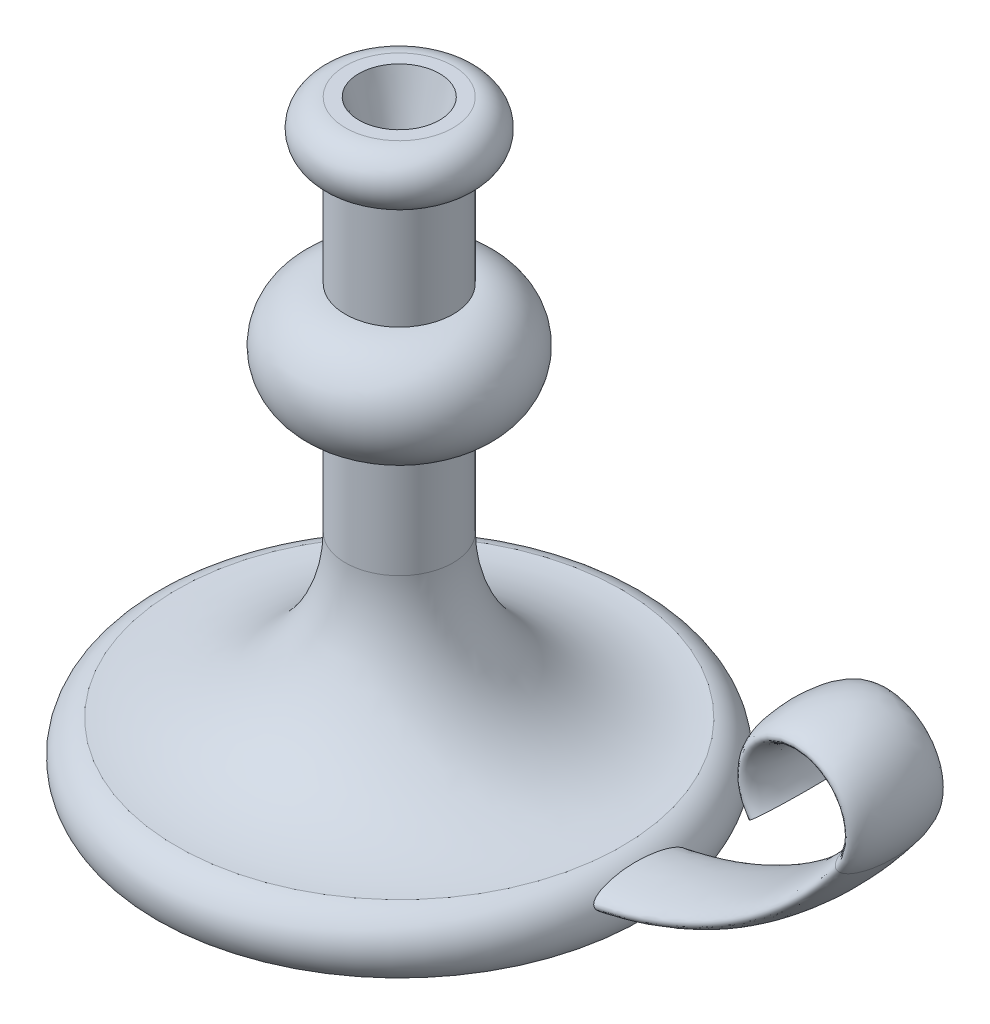
ISO-10303-21;
HEADER;
FILE_DESCRIPTION(('STEP AP214'),'2;1');
FILE_NAME('part.step','',(''),(''),'','','');
FILE_SCHEMA(('AUTOMOTIVE_DESIGN { 1 0 10303 214 1 1 1 1 }'));
ENDSEC;
DATA;
#1=APPLICATION_CONTEXT('core data for automotive mechanical design processes');
#2=APPLICATION_PROTOCOL_DEFINITION('international standard','automotive_design',2000,#1);
#3=PRODUCT_CONTEXT('',#1,'mechanical');
#4=PRODUCT('Part','Part','',(#3));
#5=PRODUCT_RELATED_PRODUCT_CATEGORY('part','',(#4));
#6=PRODUCT_DEFINITION_FORMATION('','',#4);
#7=PRODUCT_DEFINITION_CONTEXT('part definition',#1,'design');
#8=PRODUCT_DEFINITION('design','',#6,#7);
#9=PRODUCT_DEFINITION_SHAPE('','',#8);
#10=(LENGTH_UNIT() NAMED_UNIT(*) SI_UNIT(.MILLI.,.METRE.));
#11=(NAMED_UNIT(*) PLANE_ANGLE_UNIT() SI_UNIT($,.RADIAN.));
#12=(NAMED_UNIT(*) SI_UNIT($,.STERADIAN.) SOLID_ANGLE_UNIT());
#13=UNCERTAINTY_MEASURE_WITH_UNIT(LENGTH_MEASURE(1.E-05),#10,'distance_accuracy_value','');
#14=(GEOMETRIC_REPRESENTATION_CONTEXT(3) GLOBAL_UNCERTAINTY_ASSIGNED_CONTEXT((#13)) GLOBAL_UNIT_ASSIGNED_CONTEXT((#10,
#11,#12)) REPRESENTATION_CONTEXT('',''));
#15=CARTESIAN_POINT('',(0.,0.,0.));
#16=DIRECTION('',(0.,0.,1.));
#17=DIRECTION('',(1.,0.,0.));
#18=AXIS2_PLACEMENT_3D('',#15,#16,#17);
#19=CARTESIAN_POINT('',(90.,0.,0.));
#20=DIRECTION('',(0.,-1.,0.));
#21=DIRECTION('',(0.,0.,-1.));
#22=AXIS2_PLACEMENT_3D('',#19,#20,#21);
#23=PLANE('',#22);
#24=CARTESIAN_POINT('',(0.,0.,0.));
#25=DIRECTION('',(0.,-1.,0.));
#26=DIRECTION('',(0.,0.,-1.));
#27=AXIS2_PLACEMENT_3D('',#24,#25,#26);
#28=CIRCLE('',#27,90.);
#29=CARTESIAN_POINT('',(0.,0.,-90.));
#30=VERTEX_POINT('',#29);
#31=EDGE_CURVE('E77',#30,#30,#28,.T.);
#32=ORIENTED_EDGE('',*,*,#31,.T.);
#33=EDGE_LOOP('',(#32));
#34=FACE_BOUND('',#33,.T.);
#35=ADVANCED_FACE('F37',(#34),#23,.T.);
#36=CARTESIAN_POINT('',(0.,220.,0.));
#37=DIRECTION('',(0.,1.,0.));
#38=DIRECTION('',(0.,0.,1.));
#39=AXIS2_PLACEMENT_3D('',#36,#37,#38);
#40=PLANE('',#39);
#41=CARTESIAN_POINT('',(0.,220.,0.));
#42=DIRECTION('',(0.,1.,0.));
#43=DIRECTION('',(0.,0.,1.));
#44=AXIS2_PLACEMENT_3D('',#41,#42,#43);
#45=CIRCLE('',#44,15.);
#46=CARTESIAN_POINT('',(0.,220.,15.));
#47=VERTEX_POINT('',#46);
#48=EDGE_CURVE('E93',#47,#47,#45,.T.);
#49=ORIENTED_EDGE('',*,*,#48,.F.);
#50=EDGE_LOOP('',(#49));
#51=FACE_BOUND('',#50,.T.);
#52=CARTESIAN_POINT('',(0.,220.,0.));
#53=DIRECTION('',(0.,-1.,0.));
#54=DIRECTION('',(0.,0.,-1.));
#55=AXIS2_PLACEMENT_3D('',#52,#53,#54);
#56=CIRCLE('',#55,20.);
#57=CARTESIAN_POINT('',(0.,220.,-20.));
#58=VERTEX_POINT('',#57);
#59=EDGE_CURVE('E49',#58,#58,#56,.T.);
#60=ORIENTED_EDGE('',*,*,#59,.F.);
#61=EDGE_LOOP('',(#60));
#62=FACE_BOUND('',#61,.T.);
#63=ADVANCED_FACE('F100',(#51,#62),#40,.T.);
#64=CARTESIAN_POINT('',(0.,210.,0.));
#65=DIRECTION('',(0.,-1.,0.));
#66=DIRECTION('',(0.,0.,-1.));
#67=AXIS2_PLACEMENT_3D('',#64,#65,#66);
#68=TOROIDAL_SURFACE('',#67,20.,10.);
#69=ORIENTED_EDGE('',*,*,#59,.T.);
#70=EDGE_LOOP('',(#69));
#71=FACE_BOUND('',#70,.T.);
#72=CARTESIAN_POINT('',(0.,200.,0.));
#73=DIRECTION('',(0.,-1.,0.));
#74=DIRECTION('',(0.,0.,-1.));
#75=AXIS2_PLACEMENT_3D('',#72,#73,#74);
#76=CIRCLE('',#75,20.);
#77=CARTESIAN_POINT('',(0.,200.,-20.));
#78=VERTEX_POINT('',#77);
#79=EDGE_CURVE('E54',#78,#78,#76,.T.);
#80=ORIENTED_EDGE('',*,*,#79,.F.);
#81=EDGE_LOOP('',(#80));
#82=FACE_BOUND('',#81,.T.);
#83=ADVANCED_FACE('F103',(#71,#82),#68,.T.);
#84=CARTESIAN_POINT('',(0.,0.,0.));
#85=DIRECTION('',(0.,-1.,0.));
#86=DIRECTION('',(0.,0.,-1.));
#87=AXIS2_PLACEMENT_3D('',#84,#85,#86);
#88=CYLINDRICAL_SURFACE('',#87,20.);
#89=ORIENTED_EDGE('',*,*,#79,.T.);
#90=EDGE_LOOP('',(#89));
#91=FACE_BOUND('',#90,.T.);
#92=CARTESIAN_POINT('',(0.,160.,0.));
#93=DIRECTION('',(0.,-1.,0.));
#94=DIRECTION('',(0.,0.,-1.));
#95=AXIS2_PLACEMENT_3D('',#92,#93,#94);
#96=CIRCLE('',#95,20.);
#97=CARTESIAN_POINT('',(0.,160.,-20.));
#98=VERTEX_POINT('',#97);
#99=EDGE_CURVE('E59',#98,#98,#96,.T.);
#100=ORIENTED_EDGE('',*,*,#99,.F.);
#101=EDGE_LOOP('',(#100));
#102=FACE_BOUND('',#101,.T.);
#103=ADVANCED_FACE('F109',(#91,#102),#88,.T.);
#104=CARTESIAN_POINT('',(0.,140.,0.));
#105=DIRECTION('',(0.,-1.,0.));
#106=DIRECTION('',(0.,0.,-1.));
#107=AXIS2_PLACEMENT_3D('',#104,#105,#106);
#108=TOROIDAL_SURFACE('',#107,20.,20.);
#109=ORIENTED_EDGE('',*,*,#99,.T.);
#110=EDGE_LOOP('',(#109));
#111=FACE_BOUND('',#110,.T.);
#112=CARTESIAN_POINT('',(0.,120.,0.));
#113=DIRECTION('',(0.,-1.,0.));
#114=DIRECTION('',(0.,0.,-1.));
#115=AXIS2_PLACEMENT_3D('',#112,#113,#114);
#116=CIRCLE('',#115,20.);
#117=CARTESIAN_POINT('',(0.,120.,-20.));
#118=VERTEX_POINT('',#117);
#119=EDGE_CURVE('E65',#118,#118,#116,.T.);
#120=ORIENTED_EDGE('',*,*,#119,.F.);
#121=EDGE_LOOP('',(#120));
#122=FACE_BOUND('',#121,.T.);
#123=ADVANCED_FACE('F116',(#111,#122),#108,.T.);
#124=CARTESIAN_POINT('',(0.,0.,0.));
#125=DIRECTION('',(0.,-1.,0.));
#126=DIRECTION('',(0.,0.,-1.));
#127=AXIS2_PLACEMENT_3D('',#124,#125,#126);
#128=CYLINDRICAL_SURFACE('',#127,20.);
#129=ORIENTED_EDGE('',*,*,#119,.T.);
#130=EDGE_LOOP('',(#129));
#131=FACE_BOUND('',#130,.T.);
#132=CARTESIAN_POINT('',(0.,80.,0.));
#133=DIRECTION('',(0.,-1.,0.));
#134=DIRECTION('',(0.,0.,-1.));
#135=AXIS2_PLACEMENT_3D('',#132,#133,#134);
#136=CIRCLE('',#135,20.);
#137=CARTESIAN_POINT('',(0.,80.,-20.));
#138=VERTEX_POINT('',#137);
#139=EDGE_CURVE('E69',#138,#138,#136,.T.);
#140=ORIENTED_EDGE('',*,*,#139,.F.);
#141=EDGE_LOOP('',(#140));
#142=FACE_BOUND('',#141,.T.);
#143=ADVANCED_FACE('F120',(#131,#142),#128,.T.);
#144=CARTESIAN_POINT('',(0.,80.,0.));
#145=DIRECTION('',(0.,-1.,0.));
#146=DIRECTION('',(0.,0.,-1.));
#147=AXIS2_PLACEMENT_3D('',#144,#145,#146);
#148=TOROIDAL_SURFACE('',#147,80.,60.);
#149=ORIENTED_EDGE('',*,*,#139,.T.);
#150=EDGE_LOOP('',(#149));
#151=FACE_BOUND('',#150,.T.);
#152=CARTESIAN_POINT('',(0.,20.0604127662106,0.));
#153=DIRECTION('',(0.,-1.,0.));
#154=DIRECTION('',(0.,0.,-1.));
#155=AXIS2_PLACEMENT_3D('',#152,#153,#154);
#156=CIRCLE('',#155,82.6918176466758);
#157=CARTESIAN_POINT('',(0.,20.0604127662106,-82.6918176466758));
#158=VERTEX_POINT('',#157);
#159=EDGE_CURVE('E73',#158,#158,#156,.T.);
#160=ORIENTED_EDGE('',*,*,#159,.F.);
#161=EDGE_LOOP('',(#160));
#162=FACE_BOUND('',#161,.T.);
#163=ADVANCED_FACE('F124',(#151,#162),#148,.F.);
#164=CARTESIAN_POINT('',(0.,7.80412955860876,0.));
#165=DIRECTION('',(0.,-1.,0.));
#166=DIRECTION('',(0.,0.,-1.));
#167=AXIS2_PLACEMENT_3D('',#164,#165,#166);
#168=TOROIDAL_SURFACE('',#167,80.2354947983808,12.5);
#169=CARTESIAN_POINT('',(89.9114544430694,13.0125689281557,-17.5));
#170=CARTESIAN_POINT('',(89.8918494395581,13.0545530568692,-17.5000000319673));
#171=CARTESIAN_POINT('',(89.8723504327383,13.0965846784311,-17.4978616994481));
#172=CARTESIAN_POINT('',(89.8337139252528,13.1803940796436,-17.4893712876347));
#173=CARTESIAN_POINT('',(89.8145765496319,13.2221717682207,-17.483017777278));
#174=CARTESIAN_POINT('',(89.7578731512287,13.346708318175,-17.4578478667639));
#175=CARTESIAN_POINT('',(89.7210409983536,13.4286167287498,-17.4329224062271));
#176=CARTESIAN_POINT('',(89.6406792049487,13.6092209648176,-17.3608448932182));
#177=CARTESIAN_POINT('',(89.5979751658117,13.7065845766453,-17.3095434723645));
#178=CARTESIAN_POINT('',(89.5171026408207,13.8929585907188,-17.1907966743208));
#179=CARTESIAN_POINT('',(89.4789438379574,13.9819510775946,-17.1233177224062));
#180=CARTESIAN_POINT('',(89.4116736112444,14.1401772187551,-16.987033069735));
#181=CARTESIAN_POINT('',(89.3820378112262,14.2104511287674,-16.9196600451393));
#182=CARTESIAN_POINT('',(89.325399064382,14.3455590100735,-16.7785892478866));
#183=CARTESIAN_POINT('',(89.2983982616031,14.4103885454998,-16.7048864149547));
#184=CARTESIAN_POINT('',(89.2466021341337,14.5353360181844,-16.5525791880883));
#185=CARTESIAN_POINT('',(89.221812380942,14.5954420099687,-16.473963216068));
#186=CARTESIAN_POINT('',(89.1741784944434,14.7113500324322,-16.3131205829986));
#187=CARTESIAN_POINT('',(89.1513337388886,14.7671534390602,-16.2308950895712));
#188=CARTESIAN_POINT('',(89.107709728951,14.8739907970425,-16.0651636374164));
#189=CARTESIAN_POINT('',(89.0868998486337,14.9250944003824,-15.981710339594));
#190=CARTESIAN_POINT('',(89.0466530681218,15.0240996238771,-15.8125951745059));
#191=CARTESIAN_POINT('',(89.0272163988087,15.0720007055112,-15.7269329391352));
#192=CARTESIAN_POINT('',(88.970633129127,15.2115786807179,-15.4670076578166));
#193=CARTESIAN_POINT('',(88.9352760512811,15.2989759599603,-15.2900515329948));
#194=CARTESIAN_POINT('',(88.8682321852758,15.4645932241146,-14.931113227645));
#195=CARTESIAN_POINT('',(88.8365485336999,15.5428053669521,-14.7491269138523));
#196=CARTESIAN_POINT('',(88.7760111160484,15.6918660893829,-14.3807677093742));
#197=CARTESIAN_POINT('',(88.7471704021251,15.7626807881072,-14.1943790524225));
#198=CARTESIAN_POINT('',(88.6919757173861,15.8976496826662,-13.8190963338719));
#199=CARTESIAN_POINT('',(88.66561905978,15.9618110825145,-13.6302052372373));
#200=CARTESIAN_POINT('',(88.6149798687737,16.0844299690812,-13.2503701378379));
#201=CARTESIAN_POINT('',(88.5906968145087,16.1428888887237,-13.059426664254));
#202=CARTESIAN_POINT('',(88.5377615196411,16.2695248465864,-12.625450487648));
#203=CARTESIAN_POINT('',(88.5096389351837,16.3362164133888,-12.3819206103052));
#204=CARTESIAN_POINT('',(88.4558187755346,16.4627040817498,-11.8927984945203));
#205=CARTESIAN_POINT('',(88.4301214509904,16.5224994707386,-11.6472060457641));
#206=CARTESIAN_POINT('',(88.3808547036374,16.6360257318877,-11.1542883330223));
#207=CARTESIAN_POINT('',(88.3572863345827,16.6897536041079,-10.9069622755211));
#208=CARTESIAN_POINT('',(88.3120890956765,16.7917430703065,-10.4110050573224));
#209=CARTESIAN_POINT('',(88.2904603193291,16.8400044007827,-10.1623738343163));
#210=CARTESIAN_POINT('',(88.228358088122,16.9771494214216,-9.41609815932357));
#211=CARTESIAN_POINT('',(88.1905502060862,17.0586655679709,-8.91686712846689));
#212=CARTESIAN_POINT('',(88.1214020732877,17.2049527206175,-7.91567344613707));
#213=CARTESIAN_POINT('',(88.0900604561217,17.2697272651589,-7.4137113948203));
#214=CARTESIAN_POINT('',(88.0332656397219,17.3851531615458,-6.40224820872872));
#215=CARTESIAN_POINT('',(88.0078808136195,17.4356417739203,-5.8927247796836));
#216=CARTESIAN_POINT('',(87.9633782691026,17.5229541868558,-4.87216057853119));
#217=CARTESIAN_POINT('',(87.9442616188409,17.5597756585557,-4.36111956277019));
#218=CARTESIAN_POINT('',(87.9123350647478,17.6206852097668,-3.33803811783719));
#219=CARTESIAN_POINT('',(87.8995257780697,17.6447720432556,-2.82599759578626));
#220=CARTESIAN_POINT('',(87.8802886743684,17.6807673404776,-1.80201046558594));
#221=CARTESIAN_POINT('',(87.8738529339738,17.6926909256946,-1.29006453387251));
#222=CARTESIAN_POINT('',(87.8673761341253,17.7046899029697,-0.266051492955921));
#223=CARTESIAN_POINT('',(87.8673343738584,17.7047665935081,0.246015596815396));
#224=CARTESIAN_POINT('',(87.8736438178989,17.6930790003066,1.26991908599158));
#225=CARTESIAN_POINT('',(87.8799942625184,17.6813161236518,1.78175550557891));
#226=CARTESIAN_POINT('',(87.89668867555,17.6500821071934,2.67827228013831));
#227=CARTESIAN_POINT('',(87.9056553319473,17.6332391424615,3.06307216481819));
#228=CARTESIAN_POINT('',(87.9271602547281,17.5924564185168,3.83221579572617));
#229=CARTESIAN_POINT('',(87.9396986724284,17.5685163586352,4.21655952193633));
#230=CARTESIAN_POINT('',(87.9683287679903,17.5131974606373,4.9846639370352));
#231=CARTESIAN_POINT('',(87.9844212097317,17.4818170232256,5.36842448269732));
#232=CARTESIAN_POINT('',(88.0202626524263,17.4109398475768,6.1373802979259));
#233=CARTESIAN_POINT('',(88.0400332303278,17.3713950564618,6.52257016032518));
#234=CARTESIAN_POINT('',(88.0831976593449,17.2836788187787,7.29169206402316));
#235=CARTESIAN_POINT('',(88.1065908103914,17.2355090387257,7.67562433374591));
#236=CARTESIAN_POINT('',(88.1570902415786,17.1297276732935,8.44169087826621));
#237=CARTESIAN_POINT('',(88.1841940243445,17.0721224332046,8.82382618505682));
#238=CARTESIAN_POINT('',(88.2353336953938,16.9614800973801,9.49413561550508));
#239=CARTESIAN_POINT('',(88.2585331091088,16.9106916135408,9.7827449362751));
#240=CARTESIAN_POINT('',(88.3073711486581,16.8023449409606,10.358542068486));
#241=CARTESIAN_POINT('',(88.3330101863262,16.7447856088419,10.6457296312806));
#242=CARTESIAN_POINT('',(88.3870022917324,16.6219962369627,11.2185881452186));
#243=CARTESIAN_POINT('',(88.415358682873,16.5567567813337,11.5042567763468));
#244=CARTESIAN_POINT('',(88.4752065184668,16.4173842366178,12.073911282692));
#245=CARTESIAN_POINT('',(88.5067060351209,16.3432281422386,12.3578907316051));
#246=CARTESIAN_POINT('',(88.5730837541478,16.1852713271672,12.9204192746571));
#247=CARTESIAN_POINT('',(88.6079344939969,16.101548091434,13.198993226738));
#248=CARTESIAN_POINT('',(88.6820169701415,15.9220388966035,13.7515317514426));
#249=CARTESIAN_POINT('',(88.7212461207402,15.826260052793,14.0254989357631));
#250=CARTESIAN_POINT('',(88.784298447332,15.6714655912648,14.4310368085304));
#251=CARTESIAN_POINT('',(88.8059796131556,15.6181064840729,14.5651055420863));
#252=CARTESIAN_POINT('',(88.8509969663771,15.5071330133266,14.8311813676797));
#253=CARTESIAN_POINT('',(88.874332952792,15.4495191664882,14.9631887077114));
#254=CARTESIAN_POINT('',(88.9228920197364,15.3295709094703,15.2242658639003));
#255=CARTESIAN_POINT('',(88.9481099494214,15.2672493788046,15.3533425220726));
#256=CARTESIAN_POINT('',(89.0008658041441,15.1369822061495,15.6081195367423));
#257=CARTESIAN_POINT('',(89.02840305892,15.069038189101,15.7338208549244));
#258=CARTESIAN_POINT('',(89.0836770066014,14.9329939489932,15.9695103317954));
#259=CARTESIAN_POINT('',(89.1111673078318,14.8654710820042,16.0798871709336));
#260=CARTESIAN_POINT('',(89.1690263796384,14.7238990232618,16.295792455218));
#261=CARTESIAN_POINT('',(89.1993976947806,14.649844066369,16.4013164898349));
#262=CARTESIAN_POINT('',(89.2633854302169,14.4947164266399,16.6046513902326));
#263=CARTESIAN_POINT('',(89.2969733014981,14.413706042058,16.7025182437987));
#264=CARTESIAN_POINT('',(89.3683678578543,14.2428755728112,16.888483678993));
#265=CARTESIAN_POINT('',(89.4061665989549,14.1530721141386,16.9766000494129));
#266=CARTESIAN_POINT('',(89.4620835027711,14.0216344491933,17.0888331515603));
#267=CARTESIAN_POINT('',(89.4780446145758,13.9842588476568,17.119041100064));
#268=CARTESIAN_POINT('',(89.5107674575487,13.9079725126696,17.1769624205162));
#269=CARTESIAN_POINT('',(89.527529130448,13.8690618909811,17.2046759735971));
#270=CARTESIAN_POINT('',(89.5791144202158,13.7498948812134,17.2835357561082));
#271=CARTESIAN_POINT('',(89.6152350880301,13.6672109451011,17.3303944456741));
#272=CARTESIAN_POINT('',(89.6721204064053,13.5385195149415,17.3894500941522));
#273=CARTESIAN_POINT('',(89.6916708173401,13.4945393221642,17.407343100003));
#274=CARTESIAN_POINT('',(89.7315515303102,13.40538753744,17.4387255057197));
#275=CARTESIAN_POINT('',(89.7518813719119,13.3602166536528,17.4522174619584));
#276=CARTESIAN_POINT('',(89.7931810654115,13.2690638240633,17.4743638038556));
#277=CARTESIAN_POINT('',(89.8141499824111,13.2230831009881,17.4830249290395));
#278=CARTESIAN_POINT('',(89.8565869704469,13.1306750009577,17.4952415864618));
#279=CARTESIAN_POINT('',(89.8780549771552,13.0842476820121,17.4987977730138));
#280=CARTESIAN_POINT('',(89.9189551395976,12.9964313315604,17.5005858375242));
#281=CARTESIAN_POINT('',(89.9383573451177,12.955038579531,17.4993502422538));
#282=CARTESIAN_POINT('',(89.9772458427185,12.8726129569078,17.4927830362649));
#283=CARTESIAN_POINT('',(89.9967321603193,12.8315802089548,17.4874500806355));
#284=CARTESIAN_POINT('',(90.0551027147107,12.7094775315034,17.4655229989237));
#285=CARTESIAN_POINT('',(90.0939064132801,12.6293862918932,17.4430008979993));
#286=CARTESIAN_POINT('',(90.180923687047,12.4520834637436,17.376364230234));
#287=CARTESIAN_POINT('',(90.2287436885998,12.3563261003784,17.3279796808715));
#288=CARTESIAN_POINT('',(90.3215296573802,12.1733543754791,17.2149955056799));
#289=CARTESIAN_POINT('',(90.3664883387742,12.0861615377873,17.1503564101811));
#290=CARTESIAN_POINT('',(90.4474585738358,11.93134142198,17.0191944309812));
#291=CARTESIAN_POINT('',(90.4838567269101,11.862664249354,16.9541152899131));
#292=CARTESIAN_POINT('',(90.5545535601674,11.7307995751904,16.8175106547383));
#293=CARTESIAN_POINT('',(90.5888505055018,11.667616592318,16.7459799512512));
#294=CARTESIAN_POINT('',(90.6555687137423,11.5460220505032,16.5979436422557));
#295=CARTESIAN_POINT('',(90.68798637119,11.4876195800873,16.5214290355154));
#296=CARTESIAN_POINT('',(90.7510693903476,11.3751121659647,16.3646728272388));
#297=CARTESIAN_POINT('',(90.7817352257182,11.3210060590418,16.2844322438779));
#298=CARTESIAN_POINT('',(90.8454309252954,11.2096798715143,16.110272655755));
#299=CARTESIAN_POINT('',(90.8782425992417,11.1529835382732,16.0159408901696));
#300=CARTESIAN_POINT('',(90.9420974136472,11.0437366144849,15.8243288574472));
#301=CARTESIAN_POINT('',(90.9731403614317,10.9911864753607,15.7270482708446));
#302=CARTESIAN_POINT('',(91.0335957743803,10.8897925189151,15.5302947230922));
#303=CARTESIAN_POINT('',(91.0630107076555,10.8409430473766,15.4308254189586));
#304=CARTESIAN_POINT('',(91.1204152846208,10.7464372039121,15.2299929726932));
#305=CARTESIAN_POINT('',(91.1484050126822,10.7007806429075,15.1286299431556));
#306=CARTESIAN_POINT('',(91.2122228483136,10.597529099256,14.8902233185965));
#307=CARTESIAN_POINT('',(91.2475475402908,10.5410382587773,14.7525671554144));
#308=CARTESIAN_POINT('',(91.316149881061,10.4324200773406,14.4750306976235));
#309=CARTESIAN_POINT('',(91.3494272360349,10.3802933623053,14.3351500873862));
#310=CARTESIAN_POINT('',(91.4141649100895,10.2798216353373,14.0534384595629));
#311=CARTESIAN_POINT('',(91.4456231175205,10.2314809960701,13.9116054029033));
#312=CARTESIAN_POINT('',(91.5068414963205,10.1382184782221,13.6264528824068));
#313=CARTESIAN_POINT('',(91.5366015561268,10.0932968241925,13.4831333216407));
#314=CARTESIAN_POINT('',(91.6235645094192,9.963076285892,13.0511763045663));
#315=CARTESIAN_POINT('',(91.6784196539389,9.88236889351328,12.7606749973993));
#316=CARTESIAN_POINT('',(91.7829160691269,9.73069263853885,12.1746530121791));
#317=CARTESIAN_POINT('',(91.8325297073696,9.65977483703742,11.8791144298168));
#318=CARTESIAN_POINT('',(91.9267526221363,9.52669177845337,11.2855407409098));
#319=CARTESIAN_POINT('',(91.9713657636728,9.46451975192361,10.9875077565352));
#320=CARTESIAN_POINT('',(92.0560340640636,9.34775725841297,10.3893830396454));
#321=CARTESIAN_POINT('',(92.0960899611748,9.29316556312953,10.0892916489596));
#322=CARTESIAN_POINT('',(92.1885609760803,9.16828274874948,9.3557893275159));
#323=CARTESIAN_POINT('',(92.2387176378464,9.10157043803281,8.92148286645379));
#324=CARTESIAN_POINT('',(92.3309538674036,8.98015923655178,8.05022547960668));
#325=CARTESIAN_POINT('',(92.3730308374218,8.92546420875755,7.61327374974143));
#326=CARTESIAN_POINT('',(92.4495514665486,8.82682495881806,6.73744727946234));
#327=CARTESIAN_POINT('',(92.4839941962264,8.78288204562153,6.29857231152932));
#328=CARTESIAN_POINT('',(92.5455270826943,8.70488328062586,5.41999128121773));
#329=CARTESIAN_POINT('',(92.5726263188392,8.67081521608819,4.98028692820701));
#330=CARTESIAN_POINT('',(92.6197526680457,8.61184864688224,4.09995698672019));
#331=CARTESIAN_POINT('',(92.6397808547104,8.58694875017905,3.65933154832128));
#332=CARTESIAN_POINT('',(92.6729240114053,8.54587008518931,2.77743961450131));
#333=CARTESIAN_POINT('',(92.6860392882619,8.52969092983587,2.33617314840385));
#334=CARTESIAN_POINT('',(92.7075402046381,8.50320417059584,1.35841086276564));
#335=CARTESIAN_POINT('',(92.7143043419885,8.49490482312776,0.821823484050821));
#336=CARTESIAN_POINT('',(92.7178457029986,8.49055657629855,-0.251515632486717));
#337=CARTESIAN_POINT('',(92.7146213289297,8.49450963679148,-0.78826738287051));
#338=CARTESIAN_POINT('',(92.6981460862771,8.5147707288945,-1.86156396880642));
#339=CARTESIAN_POINT('',(92.684891919517,8.53108282462668,-2.3981086781957));
#340=CARTESIAN_POINT('',(92.6482033167641,8.57648344207925,-3.47060689934379));
#341=CARTESIAN_POINT('',(92.6247633461112,8.60557890999588,-4.00655993064854));
#342=CARTESIAN_POINT('',(92.5674829203375,8.67725102069643,-5.07616288081684));
#343=CARTESIAN_POINT('',(92.533659025668,8.71980620095818,-5.6098151046464));
#344=CARTESIAN_POINT('',(92.4551818797147,8.81961034462719,-6.67486296602992));
#345=CARTESIAN_POINT('',(92.4105304925081,8.87685677886527,-7.20625897601084));
#346=CARTESIAN_POINT('',(92.3097870676714,9.007812507922,-8.26559546059108));
#347=CARTESIAN_POINT('',(92.2537032444158,9.08150998601656,-8.7935381369252));
#348=CARTESIAN_POINT('',(92.1602568157539,9.20647922653347,-9.58186522198954));
#349=CARTESIAN_POINT('',(92.1275659401764,9.25052385704977,-9.84396375367561));
#350=CARTESIAN_POINT('',(92.0588950852726,9.34391734076591,-10.3667766326225));
#351=CARTESIAN_POINT('',(92.0229152864283,9.39326590293481,-10.6274910550076));
#352=CARTESIAN_POINT('',(91.955471539532,9.48674588986694,-11.0919592368297));
#353=CARTESIAN_POINT('',(91.9246743521952,9.52975512405801,-11.296035923878));
#354=CARTESIAN_POINT('',(91.8607680266927,9.61980569051669,-11.7029408411108));
#355=CARTESIAN_POINT('',(91.8276588647547,9.66684706424487,-11.9057690584349));
#356=CARTESIAN_POINT('',(91.7590272670972,9.76531989085004,-12.3095337307888));
#357=CARTESIAN_POINT('',(91.7235095098778,9.81674287998253,-12.510473036347));
#358=CARTESIAN_POINT('',(91.6497991134141,9.92461415615849,-12.9104965879925));
#359=CARTESIAN_POINT('',(91.6116066586431,9.98106209670465,-13.1095809609434));
#360=CARTESIAN_POINT('',(91.5323335600263,10.0996201666854,-13.5051751153416));
#361=CARTESIAN_POINT('',(91.4912569644094,10.1617223946346,-13.7016880636824));
#362=CARTESIAN_POINT('',(91.4056816820683,10.2927976080832,-14.09244120786));
#363=CARTESIAN_POINT('',(91.3611720380235,10.3617928199408,-14.2866716366871));
#364=CARTESIAN_POINT('',(91.2834598627347,10.4840237626494,-14.6087545340205));
#365=CARTESIAN_POINT('',(91.2512809572644,10.5350984815703,-14.7376740798066));
#366=CARTESIAN_POINT('',(91.1850114039313,10.6413883494094,-14.9933449401548));
#367=CARTESIAN_POINT('',(91.1509203125198,10.6966044599704,-15.1200957426848));
#368=CARTESIAN_POINT('',(91.0805675841629,10.8118484915113,-15.3709626979421));
#369=CARTESIAN_POINT('',(91.0443036967165,10.8718814241826,-15.4950759320838));
#370=CARTESIAN_POINT('',(90.9695613048766,10.9971456949925,-15.739031743315));
#371=CARTESIAN_POINT('',(90.9310966614818,11.0623453186417,-15.8588946952489));
#372=CARTESIAN_POINT('',(90.8514425717623,11.199178664801,-16.0938371865611));
#373=CARTESIAN_POINT('',(90.8102554410896,11.2708069374207,-16.2089206589));
#374=CARTESIAN_POINT('',(90.724744468026,11.4217115938443,-16.4325277746188));
#375=CARTESIAN_POINT('',(90.6804263334778,11.500974151509,-16.5410627186215));
#376=CARTESIAN_POINT('',(90.6131824734455,11.6231980263953,-16.6924873656526));
#377=CARTESIAN_POINT('',(90.5917185943787,11.662480386537,-16.7389999810508));
#378=CARTESIAN_POINT('',(90.5479687048363,11.7431562130077,-16.8297383551938));
#379=CARTESIAN_POINT('',(90.525682677792,11.7845497218887,-16.873964067808));
#380=CARTESIAN_POINT('',(90.4574101840748,11.9123606368251,-17.0027634974525));
#381=CARTESIAN_POINT('',(90.4100694626982,12.002299578362,-17.0833209175894));
#382=CARTESIAN_POINT('',(90.335888754873,12.145734335723,-17.1928084803619));
#383=CARTESIAN_POINT('',(90.3103978945022,12.1954370871303,-17.2276645971299));
#384=CARTESIAN_POINT('',(90.2584815847196,12.2975930242913,-17.2923812511748));
#385=CARTESIAN_POINT('',(90.2320559450009,12.3500467711674,-17.3222407640456));
#386=CARTESIAN_POINT('',(90.1785219934259,12.4573147113404,-17.375823052424));
#387=CARTESIAN_POINT('',(90.1514176273836,12.512116182126,-17.3995749712493));
#388=CARTESIAN_POINT('',(90.096639744211,12.6239343668825,-17.4400838402902));
#389=CARTESIAN_POINT('',(90.0689668975,12.6809485348608,-17.4568485837259));
#390=CARTESIAN_POINT('',(90.0195772771163,12.783684031946,-17.4796528873556));
#391=CARTESIAN_POINT('',(89.9979096858218,12.8290856538489,-17.4872511008849));
#392=CARTESIAN_POINT('',(89.9546036655469,12.9204952821506,-17.4974256169271));
#393=CARTESIAN_POINT('',(89.932965251188,12.9665035175447,-17.4999999649251));
#394=CARTESIAN_POINT('',(89.9114544430694,13.0125689281557,-17.5));
#395=B_SPLINE_CURVE_WITH_KNOTS('',3,(#169,#170,#171,#172,#173,#174,#175,#176,#177,#178,#179,
#180,#181,#182,#183,#184,#185,#186,#187,#188,#189,#190,#191,#192,#193,#194,#195,#196,#197,#198,
#199,#200,#201,#202,#203,#204,#205,#206,#207,#208,#209,#210,#211,#212,#213,#214,#215,#216,#217,
#218,#219,#220,#221,#222,#223,#224,#225,#226,#227,#228,#229,#230,#231,#232,#233,#234,#235,#236,
#237,#238,#239,#240,#241,#242,#243,#244,#245,#246,#247,#248,#249,#250,#251,#252,#253,#254,#255,
#256,#257,#258,#259,#260,#261,#262,#263,#264,#265,#266,#267,#268,#269,#270,#271,#272,#273,#274,
#275,#276,#277,#278,#279,#280,#281,#282,#283,#284,#285,#286,#287,#288,#289,#290,#291,#292,#293,
#294,#295,#296,#297,#298,#299,#300,#301,#302,#303,#304,#305,#306,#307,#308,#309,#310,#311,#312,
#313,#314,#315,#316,#317,#318,#319,#320,#321,#322,#323,#324,#325,#326,#327,#328,#329,#330,#331,
#332,#333,#334,#335,#336,#337,#338,#339,#340,#341,#342,#343,#344,#345,#346,#347,#348,#349,#350,
#351,#352,#353,#354,#355,#356,#357,#358,#359,#360,#361,#362,#363,#364,#365,#366,#367,#368,#369,
#370,#371,#372,#373,#374,#375,#376,#377,#378,#379,#380,#381,#382,#383,#384,#385,#386,#387,#388,
#389,#390,#391,#392,#393,#394),.UNSPECIFIED.,.T.,.F.,(4,2,2,2,2,2,2,2,2,2,2,2,2,2,2,2,2,2,2,2,2,
2,2,2,2,2,2,2,2,2,2,2,2,2,2,2,2,2,2,2,2,2,2,2,2,2,2,2,2,2,2,2,2,2,2,2,2,2,2,2,2,2,2,2,2,2,2,2,2,
2,2,2,2,2,2,2,2,2,2,2,2,2,2,2,2,2,2,2,2,2,2,2,2,2,2,2,2,2,2,2,2,2,2,2,2,2,2,2,2,2,2,2,4),(0.,
0.138952098052989,0.277951394818688,0.556125860902393,0.908317102905462,1.2612457057564,
1.56610169530568,1.87120370754911,2.17705400344366,2.48280608047957,2.78284320741869,
3.08293066090815,3.68399340764766,4.28556565456041,4.88978235401485,5.49333783819322,
6.09674126761341,6.85877641951524,7.62089024075218,8.38337923648869,9.14590497064579,
10.667238298296,12.1882498190353,13.7259481101777,15.26390830274,16.8020189493931,
18.3382150609648,19.8742427974479,21.4100880047299,22.5658307935188,23.7216225524252,
24.8776629722324,26.0407120601175,27.2035366664017,28.3655824667626,29.2473867167502,
30.1293400893831,31.0123862282828,31.897761625124,32.7764161798165,33.6545545582476,
34.0922373422495,34.5298670590877,34.9663400677812,35.4026873701193,35.7993097558634,
36.1962857667606,36.5900175019817,36.9830186383745,37.1348501411953,37.2866706097545,
37.5903431591718,37.7442202841317,37.8980078689292,38.051580363511,38.2051331725375,
38.3421366213218,38.479185059119,38.7532268811603,39.1036907775728,39.4550140378835,
39.758702232155,40.0626378762629,40.3671385425878,40.6715564839679,41.0159400994305,
41.3603611585747,41.7042448974235,42.0481082548156,42.5067906870915,42.9655387933907,
43.4248091410016,43.8841096264822,44.8031472553608,45.7268106329993,46.6497550913305,
47.5725498225248,48.8990129897456,50.2259019283442,51.5529523204314,52.8783544083009,
54.2035551726797,55.5286971136652,57.1385370502978,58.7486345048133,60.3592616506912,
61.9707650595173,63.579711651323,65.1883814409206,66.7958994260433,67.5991688938672,
68.4023943081387,69.0348101838143,69.6672325631046,70.298459877533,70.9296436991245,
71.5599586389449,72.1923759813957,72.619361567537,73.0464466097352,73.4739819254254,
73.89907061831,74.3238022859073,74.7477787074969,74.9413653128645,75.1349558216793,
75.5226931150065,75.7200209876906,75.9173892671968,76.1137975251651,76.309986127026,
76.4623864952888,76.6148461424989),.UNSPECIFIED.);
#396=CARTESIAN_POINT('',(89.9114544430694,13.0125689281557,-17.5));
#397=VERTEX_POINT('',#396);
#398=EDGE_CURVE('E10',#397,#397,#395,.T.);
#399=ORIENTED_EDGE('',*,*,#398,.F.);
#400=EDGE_LOOP('',(#399));
#401=FACE_BOUND('',#400,.T.);
#402=ORIENTED_EDGE('',*,*,#159,.T.);
#403=EDGE_LOOP('',(#402));
#404=FACE_BOUND('',#403,.T.);
#405=ORIENTED_EDGE('',*,*,#31,.F.);
#406=EDGE_LOOP('',(#405));
#407=FACE_BOUND('',#406,.T.);
#408=ADVANCED_FACE('F127',(#401,#404,#407),#168,.T.);
#409=CARTESIAN_POINT('',(148.,70.,0.));
#410=DIRECTION('',(0.6,-0.8,0.));
#411=DIRECTION('',(0.,0.,-1.));
#412=AXIS2_PLACEMENT_3D('',#409,#410,#411);
#413=PLANE('',#412);
#414=CARTESIAN_POINT('',(148.,70.,0.));
#415=DIRECTION('',(0.6,-0.8,0.));
#416=DIRECTION('',(0.,0.,-1.));
#417=AXIS2_PLACEMENT_3D('',#414,#415,#416);
#418=ELLIPSE('',#417,17.5,5.);
#419=CARTESIAN_POINT('',(148.,70.,-17.5));
#420=VERTEX_POINT('',#419);
#421=EDGE_CURVE('E81',#420,#420,#418,.T.);
#422=ORIENTED_EDGE('',*,*,#421,.T.);
#423=EDGE_LOOP('',(#422));
#424=FACE_BOUND('',#423,.T.);
#425=ADVANCED_FACE('F132',(#424),#413,.T.);
#426=CARTESIAN_POINT('',(60.,10.,-17.5));
#427=CARTESIAN_POINT('',(108.107236977278,10.,-17.5));
#428=CARTESIAN_POINT('',(151.135657813633,31.5142104181772,-17.5));
#429=CARTESIAN_POINT('',(180.,70.,-17.5));
#430=CARTESIAN_POINT('',(60.,20.,-17.5));
#431=CARTESIAN_POINT('',(104.90008784546,20.,-17.5));
#432=CARTESIAN_POINT('',(145.059947292724,40.0799297236321,-17.5));
#433=CARTESIAN_POINT('',(172.,76.,-17.5));
#434=CARTESIAN_POINT('',(60.,20.,17.5));
#435=CARTESIAN_POINT('',(104.90008784546,20.,17.5));
#436=CARTESIAN_POINT('',(145.059947292724,40.0799297236321,17.5));
#437=CARTESIAN_POINT('',(172.,76.,17.5));
#438=CARTESIAN_POINT('',(60.,10.,17.5));
#439=CARTESIAN_POINT('',(108.107236977278,10.,17.5));
#440=CARTESIAN_POINT('',(151.135657813633,31.5142104181772,17.5));
#441=CARTESIAN_POINT('',(180.,70.,17.5));
#442=CARTESIAN_POINT('',(60.,0.,17.5));
#443=CARTESIAN_POINT('',(111.314386109097,0.,17.5));
#444=CARTESIAN_POINT('',(157.211368334542,22.9484911127224,17.5));
#445=CARTESIAN_POINT('',(188.,64.,17.5));
#446=CARTESIAN_POINT('',(60.,0.,-17.5));
#447=CARTESIAN_POINT('',(111.314386109097,0.,-17.5));
#448=CARTESIAN_POINT('',(157.211368334542,22.9484911127224,-17.5));
#449=CARTESIAN_POINT('',(188.,64.,-17.5));
#450=CARTESIAN_POINT('',(60.,10.,-17.5));
#451=CARTESIAN_POINT('',(108.107236977278,10.,-17.5));
#452=CARTESIAN_POINT('',(151.135657813633,31.5142104181772,-17.5));
#453=CARTESIAN_POINT('',(180.,70.,-17.5));
#454=(BOUNDED_SURFACE() B_SPLINE_SURFACE(3,3,((#426,#427,#428,#429),(#430,#431,#432,#433),(#434,
#435,#436,#437),(#438,#439,#440,#441),(#442,#443,#444,#445),(#446,#447,#448,#449),(#450,#451,
#452,#453)),.UNSPECIFIED.,.T.,.F.,.F.) B_SPLINE_SURFACE_WITH_KNOTS((4,3,4),(4,4),(0.,0.5,1.),
(0.,1.),.UNSPECIFIED.) GEOMETRIC_REPRESENTATION_ITEM() RATIONAL_B_SPLINE_SURFACE(((1.,
0.929618127333277,0.929618127333277,1.),(0.333333333333333,0.309872709111092,0.309872709111092,
0.333333333333333),(0.333333333333333,0.309872709111092,0.309872709111092,0.333333333333333),
(1.,0.929618127333277,0.929618127333277,1.),(0.333333333333333,0.309872709111092,
0.309872709111092,0.333333333333333),(0.333333333333333,0.309872709111092,0.309872709111092,
0.333333333333333),(1.,0.929618127333277,0.929618127333277,1.))) REPRESENTATION_ITEM('') SURFACE());
#455=CARTESIAN_POINT('',(180.,70.,0.));
#456=DIRECTION('',(0.6,0.8,0.));
#457=DIRECTION('',(0.,0.,-1.));
#458=AXIS2_PLACEMENT_3D('',#455,#456,#457);
#459=ELLIPSE('',#458,17.5,5.);
#460=CARTESIAN_POINT('',(180.,70.,-17.5));
#461=VERTEX_POINT('',#460);
#462=EDGE_CURVE('E85',#461,#461,#459,.T.);
#463=ORIENTED_EDGE('',*,*,#398,.T.);
#464=EDGE_LOOP('',(#463));
#465=FACE_BOUND('',#464,.T.);
#466=ORIENTED_EDGE('',*,*,#462,.F.);
#467=EDGE_LOOP('',(#466));
#468=FACE_BOUND('',#467,.T.);
#469=ADVANCED_FACE('F137',(#465,#468),#454,.T.);
#470=CARTESIAN_POINT('',(180.,70.,-17.5));
#471=CARTESIAN_POINT('',(191.33126291999,85.1083505599865,-17.5));
#472=CARTESIAN_POINT('',(182.885438199983,102.,-17.5));
#473=CARTESIAN_POINT('',(164.,102.,-17.5));
#474=CARTESIAN_POINT('',(145.114561800017,102.,-17.5));
#475=CARTESIAN_POINT('',(136.66873708001,85.1083505599866,-17.5));
#476=CARTESIAN_POINT('',(148.,70.,-17.5));
#477=CARTESIAN_POINT('',(172.,76.,-17.5));
#478=CARTESIAN_POINT('',(177.665631459995,83.5541752799933,-17.5));
#479=CARTESIAN_POINT('',(173.442719099992,92.,-17.5));
#480=CARTESIAN_POINT('',(164.,92.,-17.5));
#481=CARTESIAN_POINT('',(154.557280900008,92.,-17.5));
#482=CARTESIAN_POINT('',(150.334368540005,83.5541752799932,-17.5));
#483=CARTESIAN_POINT('',(156.,76.,-17.5));
#484=CARTESIAN_POINT('',(172.,76.,17.5));
#485=CARTESIAN_POINT('',(177.665631459995,83.5541752799933,17.5));
#486=CARTESIAN_POINT('',(173.442719099992,92.,17.5));
#487=CARTESIAN_POINT('',(164.,92.,17.5));
#488=CARTESIAN_POINT('',(154.557280900008,92.,17.5));
#489=CARTESIAN_POINT('',(150.334368540005,83.5541752799932,17.5));
#490=CARTESIAN_POINT('',(156.,76.,17.5));
#491=CARTESIAN_POINT('',(180.,70.,17.5));
#492=CARTESIAN_POINT('',(191.33126291999,85.1083505599865,17.5));
#493=CARTESIAN_POINT('',(182.885438199983,102.,17.5));
#494=CARTESIAN_POINT('',(164.,102.,17.5));
#495=CARTESIAN_POINT('',(145.114561800017,102.,17.5));
#496=CARTESIAN_POINT('',(136.66873708001,85.1083505599866,17.5));
#497=CARTESIAN_POINT('',(148.,70.,17.5));
#498=CARTESIAN_POINT('',(188.,64.,17.5));
#499=CARTESIAN_POINT('',(204.996894379985,86.6625258399798,17.5));
#500=CARTESIAN_POINT('',(192.328157299975,112.,17.5));
#501=CARTESIAN_POINT('',(164.,112.,17.5));
#502=CARTESIAN_POINT('',(135.671842700025,112.,17.5));
#503=CARTESIAN_POINT('',(123.003105620015,86.6625258399798,17.5));
#504=CARTESIAN_POINT('',(140.,64.,17.5));
#505=CARTESIAN_POINT('',(188.,64.,-17.5));
#506=CARTESIAN_POINT('',(204.996894379985,86.6625258399798,-17.5));
#507=CARTESIAN_POINT('',(192.328157299975,112.,-17.5));
#508=CARTESIAN_POINT('',(164.,112.,-17.5));
#509=CARTESIAN_POINT('',(135.671842700025,112.,-17.5));
#510=CARTESIAN_POINT('',(123.003105620015,86.6625258399798,-17.5));
#511=CARTESIAN_POINT('',(140.,64.,-17.5));
#512=CARTESIAN_POINT('',(180.,70.,-17.5));
#513=CARTESIAN_POINT('',(191.33126291999,85.1083505599865,-17.5));
#514=CARTESIAN_POINT('',(182.885438199983,102.,-17.5));
#515=CARTESIAN_POINT('',(164.,102.,-17.5));
#516=CARTESIAN_POINT('',(145.114561800017,102.,-17.5));
#517=CARTESIAN_POINT('',(136.66873708001,85.1083505599866,-17.5));
#518=CARTESIAN_POINT('',(148.,70.,-17.5));
#519=(BOUNDED_SURFACE() B_SPLINE_SURFACE(3,3,((#470,#471,#472,#473,#474,#475,#476),(#477,#478,
#479,#480,#481,#482,#483),(#484,#485,#486,#487,#488,#489,#490),(#491,#492,#493,#494,#495,#496,
#497),(#498,#499,#500,#501,#502,#503,#504),(#505,#506,#507,#508,#509,#510,#511),(#512,#513,#514,
#515,#516,#517,#518)),.UNSPECIFIED.,.T.,.F.,.F.) B_SPLINE_SURFACE_WITH_KNOTS((4,3,4),(4,3,4),
(0.,0.5,1.),(0.,0.5,1.),
.UNSPECIFIED.) GEOMETRIC_REPRESENTATION_ITEM() RATIONAL_B_SPLINE_SURFACE(((1.,0.631475730333305,
0.631475730333305,1.,0.631475730333305,0.631475730333305,1.),(0.333333333333333,
0.210491910111102,0.210491910111102,0.333333333333333,0.210491910111102,0.210491910111102,
0.333333333333333),(0.333333333333333,0.210491910111102,0.210491910111102,0.333333333333333,
0.210491910111102,0.210491910111102,0.333333333333333),(1.,0.631475730333305,0.631475730333305,
1.,0.631475730333305,0.631475730333305,1.),(0.333333333333333,0.210491910111102,
0.210491910111102,0.333333333333333,0.210491910111102,0.210491910111102,0.333333333333333),
(0.333333333333333,0.210491910111102,0.210491910111102,0.333333333333333,0.210491910111102,
0.210491910111102,0.333333333333333),(1.,0.631475730333305,0.631475730333305,1.,
0.631475730333305,0.631475730333305,1.))) REPRESENTATION_ITEM('') SURFACE());
#520=ORIENTED_EDGE('',*,*,#421,.F.);
#521=EDGE_LOOP('',(#520));
#522=FACE_BOUND('',#521,.T.);
#523=ORIENTED_EDGE('',*,*,#462,.T.);
#524=EDGE_LOOP('',(#523));
#525=FACE_BOUND('',#524,.T.);
#526=ADVANCED_FACE('F134',(#522,#525),#519,.T.);
#527=CARTESIAN_POINT('',(0.,220.,0.));
#528=DIRECTION('',(0.,1.,0.));
#529=DIRECTION('',(0.,0.,1.));
#530=AXIS2_PLACEMENT_3D('',#527,#528,#529);
#531=CONICAL_SURFACE('',#530,15.,0.261799387799149);
#532=CARTESIAN_POINT('',(0.,195.,0.));
#533=DIRECTION('',(0.,1.,0.));
#534=DIRECTION('',(0.,0.,1.));
#535=AXIS2_PLACEMENT_3D('',#532,#533,#534);
#536=CIRCLE('',#535,8.30127018922193);
#537=CARTESIAN_POINT('',(0.,195.,8.30127018922193));
#538=VERTEX_POINT('',#537);
#539=EDGE_CURVE('E89',#538,#538,#536,.T.);
#540=ORIENTED_EDGE('',*,*,#539,.F.);
#541=EDGE_LOOP('',(#540));
#542=FACE_BOUND('',#541,.T.);
#543=ORIENTED_EDGE('',*,*,#48,.T.);
#544=EDGE_LOOP('',(#543));
#545=FACE_BOUND('',#544,.T.);
#546=ADVANCED_FACE('F98',(#542,#545),#531,.F.);
#547=CARTESIAN_POINT('',(0.,195.,0.));
#548=DIRECTION('',(0.,1.,0.));
#549=DIRECTION('',(0.,0.,1.));
#550=AXIS2_PLACEMENT_3D('',#547,#548,#549);
#551=PLANE('',#550);
#552=ORIENTED_EDGE('',*,*,#539,.T.);
#553=EDGE_LOOP('',(#552));
#554=FACE_BOUND('',#553,.T.);
#555=ADVANCED_FACE('F160',(#554),#551,.T.);
#556=CLOSED_SHELL('',(#35,#63,#83,#103,#123,#143,#163,#408,#425,#469,#526,#546,#555));
#557=MANIFOLD_SOLID_BREP('B2',#556);
#558=ADVANCED_BREP_SHAPE_REPRESENTATION('',(#18,#557),#14);
#559=SHAPE_DEFINITION_REPRESENTATION(#9,#558);
ENDSEC;
END-ISO-10303-21;
